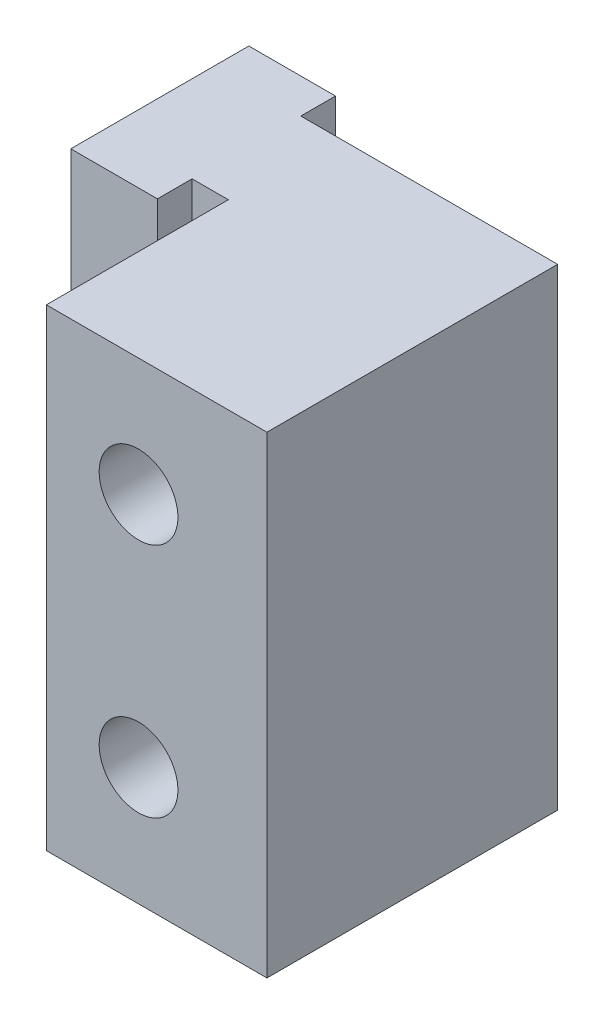
ISO-10303-21;
HEADER;
FILE_DESCRIPTION(('STEP AP214'),'2;1');
FILE_NAME('part.step','',(''),(''),'','','');
FILE_SCHEMA(('AUTOMOTIVE_DESIGN { 1 0 10303 214 1 1 1 1 }'));
ENDSEC;
DATA;
#1=APPLICATION_CONTEXT('core data for automotive mechanical design processes');
#2=APPLICATION_PROTOCOL_DEFINITION('international standard','automotive_design',2000,#1);
#3=PRODUCT_CONTEXT('',#1,'mechanical');
#4=PRODUCT('Part','Part','',(#3));
#5=PRODUCT_RELATED_PRODUCT_CATEGORY('part','',(#4));
#6=PRODUCT_DEFINITION_FORMATION('','',#4);
#7=PRODUCT_DEFINITION_CONTEXT('part definition',#1,'design');
#8=PRODUCT_DEFINITION('design','',#6,#7);
#9=PRODUCT_DEFINITION_SHAPE('','',#8);
#10=(LENGTH_UNIT() NAMED_UNIT(*) SI_UNIT(.MILLI.,.METRE.));
#11=(NAMED_UNIT(*) PLANE_ANGLE_UNIT() SI_UNIT($,.RADIAN.));
#12=(NAMED_UNIT(*) SI_UNIT($,.STERADIAN.) SOLID_ANGLE_UNIT());
#13=UNCERTAINTY_MEASURE_WITH_UNIT(LENGTH_MEASURE(1.E-05),#10,'distance_accuracy_value','');
#14=(GEOMETRIC_REPRESENTATION_CONTEXT(3) GLOBAL_UNCERTAINTY_ASSIGNED_CONTEXT((#13)) GLOBAL_UNIT_ASSIGNED_CONTEXT((#10,
#11,#12)) REPRESENTATION_CONTEXT('',''));
#15=CARTESIAN_POINT('',(0.,0.,0.));
#16=DIRECTION('',(0.,0.,1.));
#17=DIRECTION('',(1.,0.,0.));
#18=AXIS2_PLACEMENT_3D('',#15,#16,#17);
#19=CARTESIAN_POINT('',(10.9,15.,0.));
#20=DIRECTION('',(-1.,0.,0.));
#21=DIRECTION('',(0.,0.,1.));
#22=AXIS2_PLACEMENT_3D('',#19,#20,#21);
#23=PLANE('',#22);
#24=DIRECTION('',(0.,0.,-1.));
#25=VECTOR('',#24,1.);
#26=CARTESIAN_POINT('',(10.9,0.,0.));
#27=LINE('',#26,#25);
#28=CARTESIAN_POINT('',(10.9,0.,4.675));
#29=VERTEX_POINT('',#28);
#30=CARTESIAN_POINT('',(10.9,0.,-4.55));
#31=VERTEX_POINT('',#30);
#32=EDGE_CURVE('E139',#29,#31,#27,.T.);
#33=ORIENTED_EDGE('',*,*,#32,.T.);
#34=DIRECTION('',(0.,-1.,0.));
#35=VECTOR('',#34,1.);
#36=CARTESIAN_POINT('',(10.9,15.,-4.55));
#37=LINE('',#36,#35);
#38=CARTESIAN_POINT('',(10.9,15.,-4.55));
#39=VERTEX_POINT('',#38);
#40=EDGE_CURVE('E11',#39,#31,#37,.T.);
#41=ORIENTED_EDGE('',*,*,#40,.F.);
#42=DIRECTION('',(0.,0.,-1.));
#43=VECTOR('',#42,1.);
#44=CARTESIAN_POINT('',(10.9,15.,0.));
#45=LINE('',#44,#43);
#46=CARTESIAN_POINT('',(10.9,15.,4.675));
#47=VERTEX_POINT('',#46);
#48=EDGE_CURVE('E161',#47,#39,#45,.T.);
#49=ORIENTED_EDGE('',*,*,#48,.F.);
#50=DIRECTION('',(0.,-1.,0.));
#51=VECTOR('',#50,1.);
#52=CARTESIAN_POINT('',(10.9,15.,4.675));
#53=LINE('',#52,#51);
#54=EDGE_CURVE('E135',#47,#29,#53,.T.);
#55=ORIENTED_EDGE('',*,*,#54,.T.);
#56=EDGE_LOOP('',(#33,#41,#49,#55));
#57=FACE_BOUND('',#56,.T.);
#58=ADVANCED_FACE('F33',(#57),#23,.F.);
#59=CARTESIAN_POINT('',(0.,15.,-4.55));
#60=DIRECTION('',(0.,0.,1.));
#61=DIRECTION('',(1.,0.,0.));
#62=AXIS2_PLACEMENT_3D('',#59,#60,#61);
#63=PLANE('',#62);
#64=CARTESIAN_POINT('',(6.825,3.75,-4.55));
#65=DIRECTION('',(0.,0.,-1.));
#66=DIRECTION('',(-1.,0.,0.));
#67=AXIS2_PLACEMENT_3D('',#64,#65,#66);
#68=CIRCLE('',#67,1.25);
#69=CARTESIAN_POINT('',(5.575,3.75,-4.55));
#70=VERTEX_POINT('',#69);
#71=EDGE_CURVE('E309',#70,#70,#68,.T.);
#72=ORIENTED_EDGE('',*,*,#71,.F.);
#73=EDGE_LOOP('',(#72));
#74=FACE_BOUND('',#73,.T.);
#75=CARTESIAN_POINT('',(6.825,11.25,-4.55));
#76=DIRECTION('',(0.,0.,-1.));
#77=DIRECTION('',(-1.,0.,0.));
#78=AXIS2_PLACEMENT_3D('',#75,#76,#77);
#79=CIRCLE('',#78,1.25);
#80=CARTESIAN_POINT('',(5.575,11.25,-4.55));
#81=VERTEX_POINT('',#80);
#82=EDGE_CURVE('E314',#81,#81,#79,.T.);
#83=ORIENTED_EDGE('',*,*,#82,.F.);
#84=EDGE_LOOP('',(#83));
#85=FACE_BOUND('',#84,.T.);
#86=DIRECTION('',(-1.,0.,0.));
#87=VECTOR('',#86,1.);
#88=CARTESIAN_POINT('',(0.,0.,-4.55));
#89=LINE('',#88,#87);
#90=CARTESIAN_POINT('',(2.75,0.,-4.55));
#91=VERTEX_POINT('',#90);
#92=EDGE_CURVE('E142',#31,#91,#89,.T.);
#93=ORIENTED_EDGE('',*,*,#92,.T.);
#94=DIRECTION('',(0.,-1.,0.));
#95=VECTOR('',#94,1.);
#96=CARTESIAN_POINT('',(2.75,15.,-4.55));
#97=LINE('',#96,#95);
#98=CARTESIAN_POINT('',(2.75,15.,-4.55));
#99=VERTEX_POINT('',#98);
#100=EDGE_CURVE('E41',#99,#91,#97,.T.);
#101=ORIENTED_EDGE('',*,*,#100,.F.);
#102=DIRECTION('',(-1.,0.,0.));
#103=VECTOR('',#102,1.);
#104=CARTESIAN_POINT('',(0.,15.,-4.55));
#105=LINE('',#104,#103);
#106=EDGE_CURVE('E94',#39,#99,#105,.T.);
#107=ORIENTED_EDGE('',*,*,#106,.F.);
#108=ORIENTED_EDGE('',*,*,#40,.T.);
#109=EDGE_LOOP('',(#93,#101,#107,#108));
#110=FACE_BOUND('',#109,.T.);
#111=ADVANCED_FACE('F224',(#74,#85,#110),#63,.F.);
#112=CARTESIAN_POINT('',(2.75,15.,0.));
#113=DIRECTION('',(-1.,0.,0.));
#114=DIRECTION('',(0.,0.,1.));
#115=AXIS2_PLACEMENT_3D('',#112,#113,#114);
#116=PLANE('',#115);
#117=DIRECTION('',(0.,0.,-1.));
#118=VECTOR('',#117,1.);
#119=CARTESIAN_POINT('',(2.75,0.,0.));
#120=LINE('',#119,#118);
#121=CARTESIAN_POINT('',(2.75,0.,-5.65));
#122=VERTEX_POINT('',#121);
#123=EDGE_CURVE('E145',#91,#122,#120,.T.);
#124=ORIENTED_EDGE('',*,*,#123,.T.);
#125=DIRECTION('',(0.,-1.,0.));
#126=VECTOR('',#125,1.);
#127=CARTESIAN_POINT('',(2.75,15.,-5.65));
#128=LINE('',#127,#126);
#129=CARTESIAN_POINT('',(2.75,15.,-5.65));
#130=VERTEX_POINT('',#129);
#131=EDGE_CURVE('E172',#130,#122,#128,.T.);
#132=ORIENTED_EDGE('',*,*,#131,.F.);
#133=DIRECTION('',(0.,0.,-1.));
#134=VECTOR('',#133,1.);
#135=CARTESIAN_POINT('',(2.75,15.,0.));
#136=LINE('',#135,#134);
#137=EDGE_CURVE('E179',#99,#130,#136,.T.);
#138=ORIENTED_EDGE('',*,*,#137,.F.);
#139=ORIENTED_EDGE('',*,*,#100,.T.);
#140=EDGE_LOOP('',(#124,#132,#138,#139));
#141=FACE_BOUND('',#140,.T.);
#142=ADVANCED_FACE('F177',(#141),#116,.F.);
#143=CARTESIAN_POINT('',(0.,15.,-5.65));
#144=DIRECTION('',(0.,0.,-1.));
#145=DIRECTION('',(-1.,0.,0.));
#146=AXIS2_PLACEMENT_3D('',#143,#144,#145);
#147=PLANE('',#146);
#148=DIRECTION('',(1.,0.,0.));
#149=VECTOR('',#148,1.);
#150=CARTESIAN_POINT('',(0.,0.,-5.65));
#151=LINE('',#150,#149);
#152=CARTESIAN_POINT('',(0.,0.,-5.65));
#153=VERTEX_POINT('',#152);
#154=EDGE_CURVE('E148',#153,#122,#151,.T.);
#155=ORIENTED_EDGE('',*,*,#154,.F.);
#156=DIRECTION('',(0.,-1.,0.));
#157=VECTOR('',#156,1.);
#158=CARTESIAN_POINT('',(0.,15.,-5.65));
#159=LINE('',#158,#157);
#160=CARTESIAN_POINT('',(0.,15.,-5.65));
#161=VERTEX_POINT('',#160);
#162=EDGE_CURVE('E170',#161,#153,#159,.T.);
#163=ORIENTED_EDGE('',*,*,#162,.F.);
#164=DIRECTION('',(1.,0.,0.));
#165=VECTOR('',#164,1.);
#166=CARTESIAN_POINT('',(0.,15.,-5.65));
#167=LINE('',#166,#165);
#168=EDGE_CURVE('E190',#161,#130,#167,.T.);
#169=ORIENTED_EDGE('',*,*,#168,.T.);
#170=ORIENTED_EDGE('',*,*,#131,.T.);
#171=EDGE_LOOP('',(#155,#163,#169,#170));
#172=FACE_BOUND('',#171,.T.);
#173=ADVANCED_FACE('F187',(#172),#147,.T.);
#174=CARTESIAN_POINT('',(0.,15.,0.));
#175=DIRECTION('',(-1.,0.,0.));
#176=DIRECTION('',(0.,0.,1.));
#177=AXIS2_PLACEMENT_3D('',#174,#175,#176);
#178=PLANE('',#177);
#179=DIRECTION('',(0.,0.,-1.));
#180=VECTOR('',#179,1.);
#181=CARTESIAN_POINT('',(0.,0.,0.));
#182=LINE('',#181,#180);
#183=CARTESIAN_POINT('',(0.,0.,0.));
#184=VERTEX_POINT('',#183);
#185=EDGE_CURVE('E152',#184,#153,#182,.T.);
#186=ORIENTED_EDGE('',*,*,#185,.F.);
#187=DIRECTION('',(0.,-1.,0.));
#188=VECTOR('',#187,1.);
#189=CARTESIAN_POINT('',(0.,15.,0.));
#190=LINE('',#189,#188);
#191=CARTESIAN_POINT('',(0.,15.,0.));
#192=VERTEX_POINT('',#191);
#193=EDGE_CURVE('E168',#192,#184,#190,.T.);
#194=ORIENTED_EDGE('',*,*,#193,.F.);
#195=DIRECTION('',(0.,0.,-1.));
#196=VECTOR('',#195,1.);
#197=CARTESIAN_POINT('',(0.,15.,0.));
#198=LINE('',#197,#196);
#199=EDGE_CURVE('E193',#192,#161,#198,.T.);
#200=ORIENTED_EDGE('',*,*,#199,.T.);
#201=ORIENTED_EDGE('',*,*,#162,.T.);
#202=EDGE_LOOP('',(#186,#194,#200,#201));
#203=FACE_BOUND('',#202,.T.);
#204=ADVANCED_FACE('F238',(#203),#178,.T.);
#205=CARTESIAN_POINT('',(0.,15.,0.));
#206=DIRECTION('',(0.,0.,-1.));
#207=DIRECTION('',(-1.,0.,0.));
#208=AXIS2_PLACEMENT_3D('',#205,#206,#207);
#209=PLANE('',#208);
#210=DIRECTION('',(1.,0.,0.));
#211=VECTOR('',#210,1.);
#212=CARTESIAN_POINT('',(0.,0.,0.));
#213=LINE('',#212,#211);
#214=CARTESIAN_POINT('',(2.75,0.,0.));
#215=VERTEX_POINT('',#214);
#216=EDGE_CURVE('E155',#184,#215,#213,.T.);
#217=ORIENTED_EDGE('',*,*,#216,.T.);
#218=DIRECTION('',(0.,-1.,0.));
#219=VECTOR('',#218,1.);
#220=CARTESIAN_POINT('',(2.75,15.,0.));
#221=LINE('',#220,#219);
#222=CARTESIAN_POINT('',(2.75,15.,0.));
#223=VERTEX_POINT('',#222);
#224=EDGE_CURVE('E165',#223,#215,#221,.T.);
#225=ORIENTED_EDGE('',*,*,#224,.F.);
#226=DIRECTION('',(1.,0.,0.));
#227=VECTOR('',#226,1.);
#228=CARTESIAN_POINT('',(0.,15.,0.));
#229=LINE('',#228,#227);
#230=EDGE_CURVE('E195',#192,#223,#229,.T.);
#231=ORIENTED_EDGE('',*,*,#230,.F.);
#232=ORIENTED_EDGE('',*,*,#193,.T.);
#233=EDGE_LOOP('',(#217,#225,#231,#232));
#234=FACE_BOUND('',#233,.T.);
#235=ADVANCED_FACE('F202',(#234),#209,.F.);
#236=CARTESIAN_POINT('',(2.75,0.,-1.1));
#237=VERTEX_POINT('',#236);
#238=EDGE_CURVE('E149',#215,#237,#120,.T.);
#239=ORIENTED_EDGE('',*,*,#238,.T.);
#240=DIRECTION('',(0.,-1.,0.));
#241=VECTOR('',#240,1.);
#242=CARTESIAN_POINT('',(2.75,15.,-1.1));
#243=LINE('',#242,#241);
#244=CARTESIAN_POINT('',(2.75,15.,-1.1));
#245=VERTEX_POINT('',#244);
#246=EDGE_CURVE('E125',#245,#237,#243,.T.);
#247=ORIENTED_EDGE('',*,*,#246,.F.);
#248=EDGE_CURVE('E130',#223,#245,#136,.T.);
#249=ORIENTED_EDGE('',*,*,#248,.F.);
#250=ORIENTED_EDGE('',*,*,#224,.T.);
#251=EDGE_LOOP('',(#239,#247,#249,#250));
#252=FACE_BOUND('',#251,.T.);
#253=ADVANCED_FACE('F206',(#252),#116,.F.);
#254=CARTESIAN_POINT('',(0.,15.,-1.1));
#255=DIRECTION('',(0.,0.,1.));
#256=DIRECTION('',(1.,0.,0.));
#257=AXIS2_PLACEMENT_3D('',#254,#255,#256);
#258=PLANE('',#257);
#259=DIRECTION('',(-1.,0.,0.));
#260=VECTOR('',#259,1.);
#261=CARTESIAN_POINT('',(0.,0.,-1.1));
#262=LINE('',#261,#260);
#263=CARTESIAN_POINT('',(3.9,0.,-1.1));
#264=VERTEX_POINT('',#263);
#265=EDGE_CURVE('E120',#264,#237,#262,.T.);
#266=ORIENTED_EDGE('',*,*,#265,.F.);
#267=DIRECTION('',(0.,-1.,0.));
#268=VECTOR('',#267,1.);
#269=CARTESIAN_POINT('',(3.9,15.,-1.1));
#270=LINE('',#269,#268);
#271=CARTESIAN_POINT('',(3.9,15.,-1.1));
#272=VERTEX_POINT('',#271);
#273=EDGE_CURVE('E115',#272,#264,#270,.T.);
#274=ORIENTED_EDGE('',*,*,#273,.F.);
#275=DIRECTION('',(-1.,0.,0.));
#276=VECTOR('',#275,1.);
#277=CARTESIAN_POINT('',(0.,15.,-1.1));
#278=LINE('',#277,#276);
#279=EDGE_CURVE('E118',#272,#245,#278,.T.);
#280=ORIENTED_EDGE('',*,*,#279,.T.);
#281=ORIENTED_EDGE('',*,*,#246,.T.);
#282=EDGE_LOOP('',(#266,#274,#280,#281));
#283=FACE_BOUND('',#282,.T.);
#284=ADVANCED_FACE('F117',(#283),#258,.T.);
#285=CARTESIAN_POINT('',(3.9,15.,0.));
#286=DIRECTION('',(-1.,0.,0.));
#287=DIRECTION('',(0.,0.,1.));
#288=AXIS2_PLACEMENT_3D('',#285,#286,#287);
#289=PLANE('',#288);
#290=DIRECTION('',(0.,0.,-1.));
#291=VECTOR('',#290,1.);
#292=CARTESIAN_POINT('',(3.9,0.,0.));
#293=LINE('',#292,#291);
#294=CARTESIAN_POINT('',(3.9,0.,4.675));
#295=VERTEX_POINT('',#294);
#296=EDGE_CURVE('E158',#295,#264,#293,.T.);
#297=ORIENTED_EDGE('',*,*,#296,.F.);
#298=DIRECTION('',(0.,-1.,0.));
#299=VECTOR('',#298,1.);
#300=CARTESIAN_POINT('',(3.9,15.,4.675));
#301=LINE('',#300,#299);
#302=CARTESIAN_POINT('',(3.9,15.,4.675));
#303=VERTEX_POINT('',#302);
#304=EDGE_CURVE('E83',#303,#295,#301,.T.);
#305=ORIENTED_EDGE('',*,*,#304,.F.);
#306=DIRECTION('',(0.,0.,-1.));
#307=VECTOR('',#306,1.);
#308=CARTESIAN_POINT('',(3.9,15.,0.));
#309=LINE('',#308,#307);
#310=EDGE_CURVE('E128',#303,#272,#309,.T.);
#311=ORIENTED_EDGE('',*,*,#310,.T.);
#312=ORIENTED_EDGE('',*,*,#273,.T.);
#313=EDGE_LOOP('',(#297,#305,#311,#312));
#314=FACE_BOUND('',#313,.T.);
#315=ADVANCED_FACE('F133',(#314),#289,.T.);
#316=CARTESIAN_POINT('',(0.,15.,4.675));
#317=DIRECTION('',(0.,0.,-1.));
#318=DIRECTION('',(-1.,0.,0.));
#319=AXIS2_PLACEMENT_3D('',#316,#317,#318);
#320=PLANE('',#319);
#321=CARTESIAN_POINT('',(6.825,3.75,4.675));
#322=DIRECTION('',(0.,0.,-1.));
#323=DIRECTION('',(-1.,0.,0.));
#324=AXIS2_PLACEMENT_3D('',#321,#322,#323);
#325=CIRCLE('',#324,1.25);
#326=CARTESIAN_POINT('',(5.575,3.75,4.675));
#327=VERTEX_POINT('',#326);
#328=EDGE_CURVE('E143',#327,#327,#325,.T.);
#329=ORIENTED_EDGE('',*,*,#328,.T.);
#330=EDGE_LOOP('',(#329));
#331=FACE_BOUND('',#330,.T.);
#332=CARTESIAN_POINT('',(6.825,11.25,4.675));
#333=DIRECTION('',(0.,0.,-1.));
#334=DIRECTION('',(-1.,0.,0.));
#335=AXIS2_PLACEMENT_3D('',#332,#333,#334);
#336=CIRCLE('',#335,1.25);
#337=CARTESIAN_POINT('',(5.575,11.25,4.675));
#338=VERTEX_POINT('',#337);
#339=EDGE_CURVE('E310',#338,#338,#336,.T.);
#340=ORIENTED_EDGE('',*,*,#339,.T.);
#341=EDGE_LOOP('',(#340));
#342=FACE_BOUND('',#341,.T.);
#343=DIRECTION('',(1.,0.,0.));
#344=VECTOR('',#343,1.);
#345=CARTESIAN_POINT('',(0.,0.,4.675));
#346=LINE('',#345,#344);
#347=EDGE_CURVE('E86',#295,#29,#346,.T.);
#348=ORIENTED_EDGE('',*,*,#347,.T.);
#349=ORIENTED_EDGE('',*,*,#54,.F.);
#350=DIRECTION('',(1.,0.,0.));
#351=VECTOR('',#350,1.);
#352=CARTESIAN_POINT('',(0.,15.,4.675));
#353=LINE('',#352,#351);
#354=EDGE_CURVE('E49',#303,#47,#353,.T.);
#355=ORIENTED_EDGE('',*,*,#354,.F.);
#356=ORIENTED_EDGE('',*,*,#304,.T.);
#357=EDGE_LOOP('',(#348,#349,#355,#356));
#358=FACE_BOUND('',#357,.T.);
#359=ADVANCED_FACE('F210',(#331,#342,#358),#320,.F.);
#360=CARTESIAN_POINT('',(0.,15.,0.));
#361=DIRECTION('',(0.,1.,0.));
#362=DIRECTION('',(0.,0.,1.));
#363=AXIS2_PLACEMENT_3D('',#360,#361,#362);
#364=PLANE('',#363);
#365=ORIENTED_EDGE('',*,*,#48,.T.);
#366=ORIENTED_EDGE('',*,*,#106,.T.);
#367=ORIENTED_EDGE('',*,*,#137,.T.);
#368=ORIENTED_EDGE('',*,*,#168,.F.);
#369=ORIENTED_EDGE('',*,*,#199,.F.);
#370=ORIENTED_EDGE('',*,*,#230,.T.);
#371=ORIENTED_EDGE('',*,*,#248,.T.);
#372=ORIENTED_EDGE('',*,*,#279,.F.);
#373=ORIENTED_EDGE('',*,*,#310,.F.);
#374=ORIENTED_EDGE('',*,*,#354,.T.);
#375=EDGE_LOOP('',(#365,#366,#367,#368,#369,#370,#371,#372,#373,#374));
#376=FACE_BOUND('',#375,.T.);
#377=ADVANCED_FACE('F127',(#376),#364,.T.);
#378=CARTESIAN_POINT('',(0.,0.,0.));
#379=DIRECTION('',(0.,1.,0.));
#380=DIRECTION('',(0.,0.,1.));
#381=AXIS2_PLACEMENT_3D('',#378,#379,#380);
#382=PLANE('',#381);
#383=ORIENTED_EDGE('',*,*,#32,.F.);
#384=ORIENTED_EDGE('',*,*,#347,.F.);
#385=ORIENTED_EDGE('',*,*,#296,.T.);
#386=ORIENTED_EDGE('',*,*,#265,.T.);
#387=ORIENTED_EDGE('',*,*,#238,.F.);
#388=ORIENTED_EDGE('',*,*,#216,.F.);
#389=ORIENTED_EDGE('',*,*,#185,.T.);
#390=ORIENTED_EDGE('',*,*,#154,.T.);
#391=ORIENTED_EDGE('',*,*,#123,.F.);
#392=ORIENTED_EDGE('',*,*,#92,.F.);
#393=EDGE_LOOP('',(#383,#384,#385,#386,#387,#388,#389,#390,#391,#392));
#394=FACE_BOUND('',#393,.T.);
#395=ADVANCED_FACE('F182',(#394),#382,.F.);
#396=CARTESIAN_POINT('',(6.825,11.25,4.675));
#397=DIRECTION('',(0.,0.,-1.));
#398=DIRECTION('',(-1.,0.,0.));
#399=AXIS2_PLACEMENT_3D('',#396,#397,#398);
#400=CYLINDRICAL_SURFACE('',#399,1.25);
#401=ORIENTED_EDGE('',*,*,#339,.F.);
#402=EDGE_LOOP('',(#401));
#403=FACE_BOUND('',#402,.T.);
#404=ORIENTED_EDGE('',*,*,#82,.T.);
#405=EDGE_LOOP('',(#404));
#406=FACE_BOUND('',#405,.T.);
#407=ADVANCED_FACE('F272',(#403,#406),#400,.F.);
#408=CARTESIAN_POINT('',(6.825,3.75,4.675));
#409=DIRECTION('',(0.,0.,-1.));
#410=DIRECTION('',(-1.,0.,0.));
#411=AXIS2_PLACEMENT_3D('',#408,#409,#410);
#412=CYLINDRICAL_SURFACE('',#411,1.25);
#413=ORIENTED_EDGE('',*,*,#328,.F.);
#414=EDGE_LOOP('',(#413));
#415=FACE_BOUND('',#414,.T.);
#416=ORIENTED_EDGE('',*,*,#71,.T.);
#417=EDGE_LOOP('',(#416));
#418=FACE_BOUND('',#417,.T.);
#419=ADVANCED_FACE('F292',(#415,#418),#412,.F.);
#420=CLOSED_SHELL('',(#58,#111,#142,#173,#204,#235,#253,#284,#315,#359,#377,#395,#407,#419));
#421=MANIFOLD_SOLID_BREP('B2',#420);
#422=ADVANCED_BREP_SHAPE_REPRESENTATION('',(#18,#421),#14);
#423=SHAPE_DEFINITION_REPRESENTATION(#9,#422);
ENDSEC;
END-ISO-10303-21;
